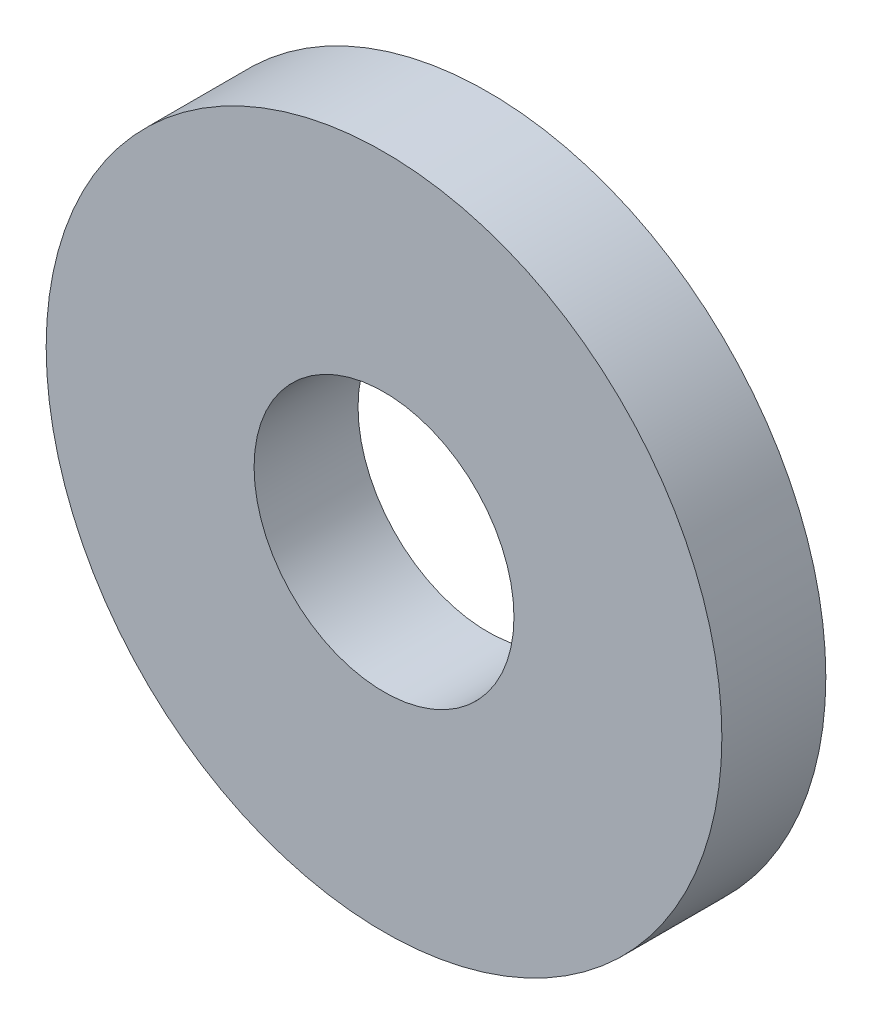
ISO-10303-21;
HEADER;
FILE_DESCRIPTION(('STEP AP214'),'2;1');
FILE_NAME('part.step','',(''),(''),'','','');
FILE_SCHEMA(('AUTOMOTIVE_DESIGN { 1 0 10303 214 1 1 1 1 }'));
ENDSEC;
DATA;
#1=APPLICATION_CONTEXT('core data for automotive mechanical design processes');
#2=APPLICATION_PROTOCOL_DEFINITION('international standard','automotive_design',2000,#1);
#3=PRODUCT_CONTEXT('',#1,'mechanical');
#4=PRODUCT('Part','Part','',(#3));
#5=PRODUCT_RELATED_PRODUCT_CATEGORY('part','',(#4));
#6=PRODUCT_DEFINITION_FORMATION('','',#4);
#7=PRODUCT_DEFINITION_CONTEXT('part definition',#1,'design');
#8=PRODUCT_DEFINITION('design','',#6,#7);
#9=PRODUCT_DEFINITION_SHAPE('','',#8);
#10=(LENGTH_UNIT() NAMED_UNIT(*) SI_UNIT(.MILLI.,.METRE.));
#11=(NAMED_UNIT(*) PLANE_ANGLE_UNIT() SI_UNIT($,.RADIAN.));
#12=(NAMED_UNIT(*) SI_UNIT($,.STERADIAN.) SOLID_ANGLE_UNIT());
#13=UNCERTAINTY_MEASURE_WITH_UNIT(LENGTH_MEASURE(1.E-05),#10,'distance_accuracy_value','');
#14=(GEOMETRIC_REPRESENTATION_CONTEXT(3) GLOBAL_UNCERTAINTY_ASSIGNED_CONTEXT((#13)) GLOBAL_UNIT_ASSIGNED_CONTEXT((#10,
#11,#12)) REPRESENTATION_CONTEXT('',''));
#15=CARTESIAN_POINT('',(0.,0.,0.));
#16=DIRECTION('',(0.,0.,1.));
#17=DIRECTION('',(1.,0.,0.));
#18=AXIS2_PLACEMENT_3D('',#15,#16,#17);
#19=CARTESIAN_POINT('',(0.,0.,2.));
#20=DIRECTION('',(0.,0.,1.));
#21=DIRECTION('',(1.,0.,0.));
#22=AXIS2_PLACEMENT_3D('',#19,#20,#21);
#23=PLANE('',#22);
#24=CARTESIAN_POINT('',(0.,0.,2.));
#25=DIRECTION('',(0.,0.,1.));
#26=DIRECTION('',(1.,0.,0.));
#27=AXIS2_PLACEMENT_3D('',#24,#25,#26);
#28=CIRCLE('',#27,6.5);
#29=CARTESIAN_POINT('',(6.5,0.,2.));
#30=VERTEX_POINT('',#29);
#31=EDGE_CURVE('E10',#30,#30,#28,.T.);
#32=ORIENTED_EDGE('',*,*,#31,.T.);
#33=EDGE_LOOP('',(#32));
#34=FACE_BOUND('',#33,.T.);
#35=CARTESIAN_POINT('',(0.,0.,2.));
#36=DIRECTION('',(0.,0.,1.));
#37=DIRECTION('',(1.,0.,0.));
#38=AXIS2_PLACEMENT_3D('',#35,#36,#37);
#39=CIRCLE('',#38,2.5);
#40=CARTESIAN_POINT('',(2.5,0.,2.));
#41=VERTEX_POINT('',#40);
#42=EDGE_CURVE('E42',#41,#41,#39,.T.);
#43=ORIENTED_EDGE('',*,*,#42,.F.);
#44=EDGE_LOOP('',(#43));
#45=FACE_BOUND('',#44,.T.);
#46=ADVANCED_FACE('F31',(#34,#45),#23,.T.);
#47=CARTESIAN_POINT('',(0.,0.,0.));
#48=DIRECTION('',(0.,0.,1.));
#49=DIRECTION('',(1.,0.,0.));
#50=AXIS2_PLACEMENT_3D('',#47,#48,#49);
#51=PLANE('',#50);
#52=CARTESIAN_POINT('',(0.,0.,0.));
#53=DIRECTION('',(0.,0.,1.));
#54=DIRECTION('',(1.,0.,0.));
#55=AXIS2_PLACEMENT_3D('',#52,#53,#54);
#56=CIRCLE('',#55,6.5);
#57=CARTESIAN_POINT('',(6.5,0.,0.));
#58=VERTEX_POINT('',#57);
#59=EDGE_CURVE('E35',#58,#58,#56,.T.);
#60=ORIENTED_EDGE('',*,*,#59,.F.);
#61=EDGE_LOOP('',(#60));
#62=FACE_BOUND('',#61,.T.);
#63=CARTESIAN_POINT('',(0.,0.,0.));
#64=DIRECTION('',(0.,0.,1.));
#65=DIRECTION('',(1.,0.,0.));
#66=AXIS2_PLACEMENT_3D('',#63,#64,#65);
#67=CIRCLE('',#66,2.5);
#68=CARTESIAN_POINT('',(2.5,0.,0.));
#69=VERTEX_POINT('',#68);
#70=EDGE_CURVE('E44',#69,#69,#67,.T.);
#71=ORIENTED_EDGE('',*,*,#70,.T.);
#72=EDGE_LOOP('',(#71));
#73=FACE_BOUND('',#72,.T.);
#74=ADVANCED_FACE('F54',(#62,#73),#51,.F.);
#75=CARTESIAN_POINT('',(0.,0.,2.));
#76=DIRECTION('',(0.,0.,-1.));
#77=DIRECTION('',(-1.,0.,0.));
#78=AXIS2_PLACEMENT_3D('',#75,#76,#77);
#79=CYLINDRICAL_SURFACE('',#78,6.5);
#80=ORIENTED_EDGE('',*,*,#31,.F.);
#81=EDGE_LOOP('',(#80));
#82=FACE_BOUND('',#81,.T.);
#83=ORIENTED_EDGE('',*,*,#59,.T.);
#84=EDGE_LOOP('',(#83));
#85=FACE_BOUND('',#84,.T.);
#86=ADVANCED_FACE('F33',(#82,#85),#79,.T.);
#87=CARTESIAN_POINT('',(0.,0.,2.));
#88=DIRECTION('',(0.,0.,-1.));
#89=DIRECTION('',(-1.,0.,0.));
#90=AXIS2_PLACEMENT_3D('',#87,#88,#89);
#91=CYLINDRICAL_SURFACE('',#90,2.5);
#92=ORIENTED_EDGE('',*,*,#42,.T.);
#93=EDGE_LOOP('',(#92));
#94=FACE_BOUND('',#93,.T.);
#95=ORIENTED_EDGE('',*,*,#70,.F.);
#96=EDGE_LOOP('',(#95));
#97=FACE_BOUND('',#96,.T.);
#98=ADVANCED_FACE('F50',(#94,#97),#91,.F.);
#99=CLOSED_SHELL('',(#46,#74,#86,#98));
#100=MANIFOLD_SOLID_BREP('B2',#99);
#101=ADVANCED_BREP_SHAPE_REPRESENTATION('',(#18,#100),#14);
#102=SHAPE_DEFINITION_REPRESENTATION(#9,#101);
ENDSEC;
END-ISO-10303-21;
